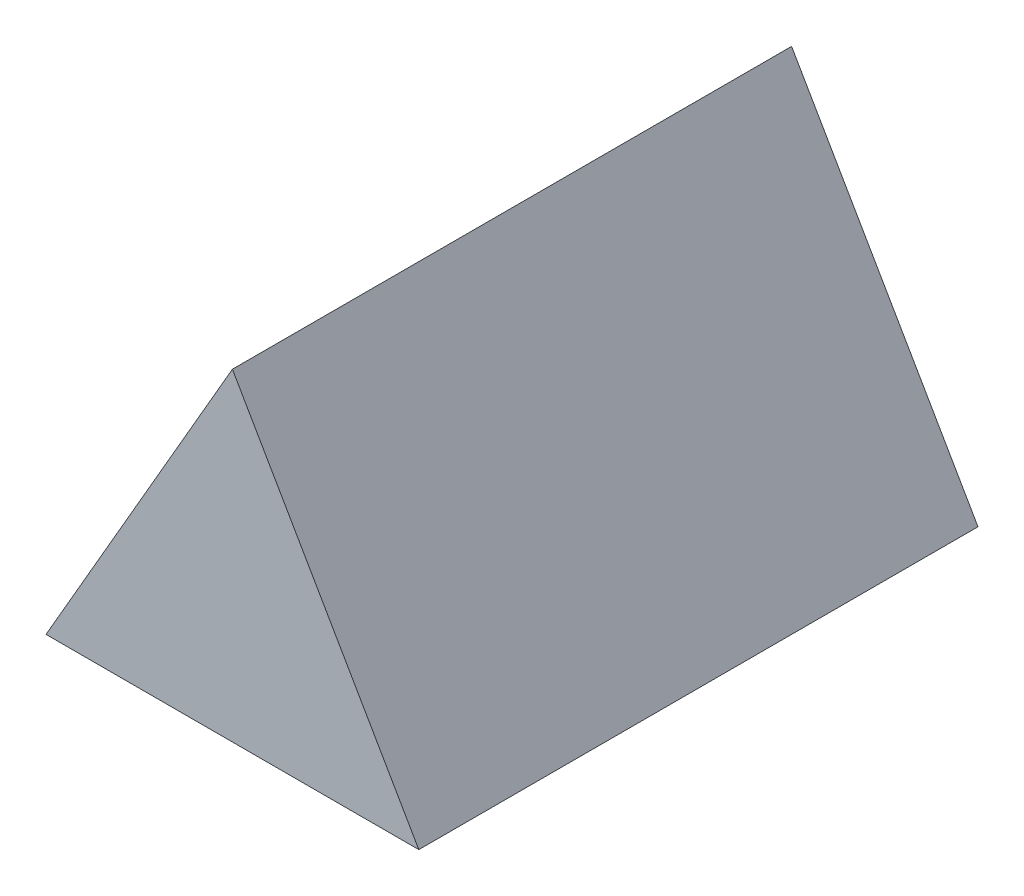
ISO-10303-21;
HEADER;
FILE_DESCRIPTION(('STEP AP214'),'2;1');
FILE_NAME('part.step','',(''),(''),'','','');
FILE_SCHEMA(('AUTOMOTIVE_DESIGN { 1 0 10303 214 1 1 1 1 }'));
ENDSEC;
DATA;
#1=APPLICATION_CONTEXT('core data for automotive mechanical design processes');
#2=APPLICATION_PROTOCOL_DEFINITION('international standard','automotive_design',2000,#1);
#3=PRODUCT_CONTEXT('',#1,'mechanical');
#4=PRODUCT('Part','Part','',(#3));
#5=PRODUCT_RELATED_PRODUCT_CATEGORY('part','',(#4));
#6=PRODUCT_DEFINITION_FORMATION('','',#4);
#7=PRODUCT_DEFINITION_CONTEXT('part definition',#1,'design');
#8=PRODUCT_DEFINITION('design','',#6,#7);
#9=PRODUCT_DEFINITION_SHAPE('','',#8);
#10=(LENGTH_UNIT() NAMED_UNIT(*) SI_UNIT(.MILLI.,.METRE.));
#11=(NAMED_UNIT(*) PLANE_ANGLE_UNIT() SI_UNIT($,.RADIAN.));
#12=(NAMED_UNIT(*) SI_UNIT($,.STERADIAN.) SOLID_ANGLE_UNIT());
#13=UNCERTAINTY_MEASURE_WITH_UNIT(LENGTH_MEASURE(1.E-05),#10,'distance_accuracy_value','');
#14=(GEOMETRIC_REPRESENTATION_CONTEXT(3) GLOBAL_UNCERTAINTY_ASSIGNED_CONTEXT((#13)) GLOBAL_UNIT_ASSIGNED_CONTEXT((#10,
#11,#12)) REPRESENTATION_CONTEXT('',''));
#15=CARTESIAN_POINT('',(0.,0.,0.));
#16=DIRECTION('',(0.,0.,1.));
#17=DIRECTION('',(1.,0.,0.));
#18=AXIS2_PLACEMENT_3D('',#15,#16,#17);
#19=CARTESIAN_POINT('',(10.,17.3205080756888,30.));
#20=DIRECTION('',(-0.866025403784439,-0.5,0.));
#21=DIRECTION('',(0.5,-0.866025403784439,0.));
#22=AXIS2_PLACEMENT_3D('',#19,#20,#21);
#23=PLANE('',#22);
#24=DIRECTION('',(0.,0.,1.));
#25=VECTOR('',#24,1.);
#26=CARTESIAN_POINT('',(10.,17.3205080756888,30.));
#27=LINE('',#26,#25);
#28=CARTESIAN_POINT('',(10.,17.3205080756888,0.));
#29=VERTEX_POINT('',#28);
#30=CARTESIAN_POINT('',(10.,17.3205080756888,30.));
#31=VERTEX_POINT('',#30);
#32=EDGE_CURVE('E53',#29,#31,#27,.T.);
#33=ORIENTED_EDGE('',*,*,#32,.T.);
#34=DIRECTION('',(0.5,-0.866025403784439,0.));
#35=VECTOR('',#34,1.);
#36=CARTESIAN_POINT('',(10.,17.3205080756888,30.));
#37=LINE('',#36,#35);
#38=CARTESIAN_POINT('',(20.,0.,30.));
#39=VERTEX_POINT('',#38);
#40=EDGE_CURVE('E20',#31,#39,#37,.T.);
#41=ORIENTED_EDGE('',*,*,#40,.T.);
#42=DIRECTION('',(0.,0.,1.));
#43=VECTOR('',#42,1.);
#44=CARTESIAN_POINT('',(20.,0.,30.));
#45=LINE('',#44,#43);
#46=CARTESIAN_POINT('',(20.,0.,0.));
#47=VERTEX_POINT('',#46);
#48=EDGE_CURVE('E52',#39,#47,#45,.F.);
#49=ORIENTED_EDGE('',*,*,#48,.T.);
#50=DIRECTION('',(0.5,-0.866025403784439,0.));
#51=VECTOR('',#50,1.);
#52=CARTESIAN_POINT('',(10.,17.3205080756888,0.));
#53=LINE('',#52,#51);
#54=EDGE_CURVE('E46',#29,#47,#53,.T.);
#55=ORIENTED_EDGE('',*,*,#54,.F.);
#56=EDGE_LOOP('',(#33,#41,#49,#55));
#57=FACE_BOUND('',#56,.T.);
#58=ADVANCED_FACE('F17',(#57),#23,.F.);
#59=CARTESIAN_POINT('',(0.,0.,30.));
#60=DIRECTION('',(0.,0.,-1.));
#61=DIRECTION('',(-1.,0.,0.));
#62=AXIS2_PLACEMENT_3D('',#59,#60,#61);
#63=PLANE('',#62);
#64=DIRECTION('',(1.,0.,0.));
#65=VECTOR('',#64,1.);
#66=CARTESIAN_POINT('',(0.,0.,30.));
#67=LINE('',#66,#65);
#68=CARTESIAN_POINT('',(0.,0.,30.));
#69=VERTEX_POINT('',#68);
#70=EDGE_CURVE('E58',#69,#39,#67,.T.);
#71=ORIENTED_EDGE('',*,*,#70,.T.);
#72=ORIENTED_EDGE('',*,*,#40,.F.);
#73=DIRECTION('',(0.5,0.866025403784439,0.));
#74=VECTOR('',#73,1.);
#75=CARTESIAN_POINT('',(0.,0.,30.));
#76=LINE('',#75,#74);
#77=EDGE_CURVE('E65',#31,#69,#76,.F.);
#78=ORIENTED_EDGE('',*,*,#77,.T.);
#79=EDGE_LOOP('',(#71,#72,#78));
#80=FACE_BOUND('',#79,.T.);
#81=ADVANCED_FACE('F64',(#80),#63,.F.);
#82=CARTESIAN_POINT('',(0.,0.,30.));
#83=DIRECTION('',(0.,1.,0.));
#84=DIRECTION('',(0.,0.,1.));
#85=AXIS2_PLACEMENT_3D('',#82,#83,#84);
#86=PLANE('',#85);
#87=ORIENTED_EDGE('',*,*,#48,.F.);
#88=ORIENTED_EDGE('',*,*,#70,.F.);
#89=DIRECTION('',(0.,0.,1.));
#90=VECTOR('',#89,1.);
#91=CARTESIAN_POINT('',(0.,0.,30.));
#92=LINE('',#91,#90);
#93=CARTESIAN_POINT('',(0.,0.,0.));
#94=VERTEX_POINT('',#93);
#95=EDGE_CURVE('E26',#69,#94,#92,.F.);
#96=ORIENTED_EDGE('',*,*,#95,.T.);
#97=DIRECTION('',(-1.,0.,0.));
#98=VECTOR('',#97,1.);
#99=CARTESIAN_POINT('',(0.,0.,0.));
#100=LINE('',#99,#98);
#101=EDGE_CURVE('E34',#47,#94,#100,.T.);
#102=ORIENTED_EDGE('',*,*,#101,.F.);
#103=EDGE_LOOP('',(#87,#88,#96,#102));
#104=FACE_BOUND('',#103,.T.);
#105=ADVANCED_FACE('F60',(#104),#86,.F.);
#106=CARTESIAN_POINT('',(0.,0.,0.));
#107=DIRECTION('',(0.,0.,-1.));
#108=DIRECTION('',(-1.,0.,0.));
#109=AXIS2_PLACEMENT_3D('',#106,#107,#108);
#110=PLANE('',#109);
#111=ORIENTED_EDGE('',*,*,#54,.T.);
#112=ORIENTED_EDGE('',*,*,#101,.T.);
#113=DIRECTION('',(0.5,0.866025403784439,0.));
#114=VECTOR('',#113,1.);
#115=CARTESIAN_POINT('',(0.,0.,0.));
#116=LINE('',#115,#114);
#117=EDGE_CURVE('E11',#94,#29,#116,.T.);
#118=ORIENTED_EDGE('',*,*,#117,.T.);
#119=EDGE_LOOP('',(#111,#112,#118));
#120=FACE_BOUND('',#119,.T.);
#121=ADVANCED_FACE('F73',(#120),#110,.T.);
#122=CARTESIAN_POINT('',(0.,0.,30.));
#123=DIRECTION('',(0.866025403784439,-0.5,0.));
#124=DIRECTION('',(0.5,0.866025403784439,0.));
#125=AXIS2_PLACEMENT_3D('',#122,#123,#124);
#126=PLANE('',#125);
#127=ORIENTED_EDGE('',*,*,#95,.F.);
#128=ORIENTED_EDGE('',*,*,#77,.F.);
#129=ORIENTED_EDGE('',*,*,#32,.F.);
#130=ORIENTED_EDGE('',*,*,#117,.F.);
#131=EDGE_LOOP('',(#127,#128,#129,#130));
#132=FACE_BOUND('',#131,.T.);
#133=ADVANCED_FACE('F72',(#132),#126,.F.);
#134=CLOSED_SHELL('',(#58,#81,#105,#121,#133));
#135=MANIFOLD_SOLID_BREP('B1',#134);
#136=ADVANCED_BREP_SHAPE_REPRESENTATION('',(#18,#135),#14);
#137=SHAPE_DEFINITION_REPRESENTATION(#9,#136);
ENDSEC;
END-ISO-10303-21;
